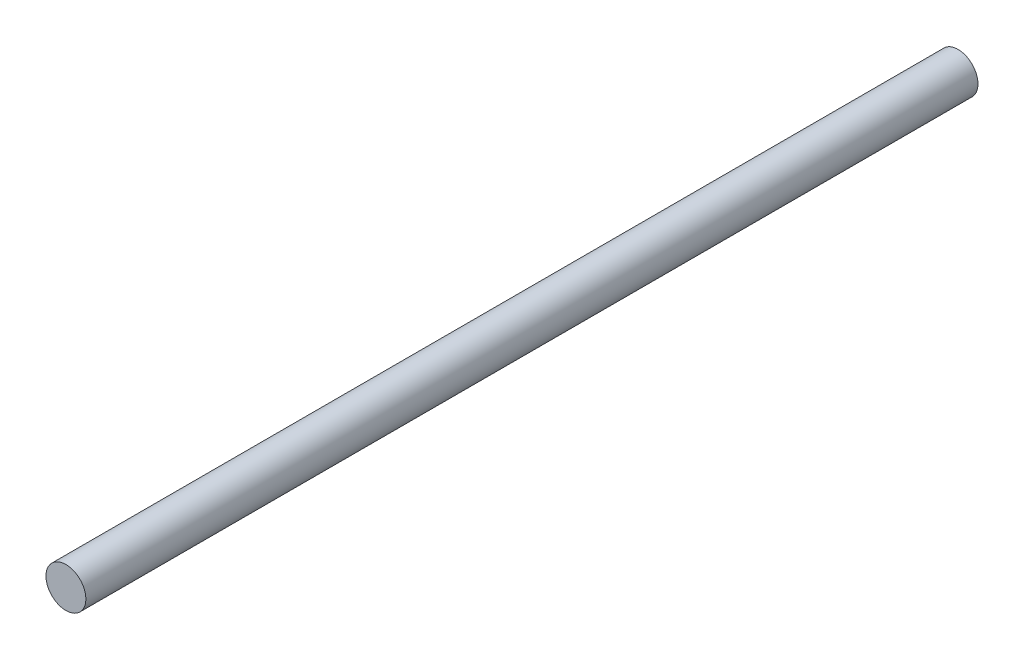
ISO-10303-21;
HEADER;
FILE_DESCRIPTION(('STEP AP214'),'2;1');
FILE_NAME('part.step','',(''),(''),'','','');
FILE_SCHEMA(('AUTOMOTIVE_DESIGN { 1 0 10303 214 1 1 1 1 }'));
ENDSEC;
DATA;
#1=APPLICATION_CONTEXT('core data for automotive mechanical design processes');
#2=APPLICATION_PROTOCOL_DEFINITION('international standard','automotive_design',2000,#1);
#3=PRODUCT_CONTEXT('',#1,'mechanical');
#4=PRODUCT('Part','Part','',(#3));
#5=PRODUCT_RELATED_PRODUCT_CATEGORY('part','',(#4));
#6=PRODUCT_DEFINITION_FORMATION('','',#4);
#7=PRODUCT_DEFINITION_CONTEXT('part definition',#1,'design');
#8=PRODUCT_DEFINITION('design','',#6,#7);
#9=PRODUCT_DEFINITION_SHAPE('','',#8);
#10=(LENGTH_UNIT() NAMED_UNIT(*) SI_UNIT(.MILLI.,.METRE.));
#11=(NAMED_UNIT(*) PLANE_ANGLE_UNIT() SI_UNIT($,.RADIAN.));
#12=(NAMED_UNIT(*) SI_UNIT($,.STERADIAN.) SOLID_ANGLE_UNIT());
#13=UNCERTAINTY_MEASURE_WITH_UNIT(LENGTH_MEASURE(1.E-05),#10,'distance_accuracy_value','');
#14=(GEOMETRIC_REPRESENTATION_CONTEXT(3) GLOBAL_UNCERTAINTY_ASSIGNED_CONTEXT((#13)) GLOBAL_UNIT_ASSIGNED_CONTEXT((#10,
#11,#12)) REPRESENTATION_CONTEXT('',''));
#15=CARTESIAN_POINT('',(0.,0.,0.));
#16=DIRECTION('',(0.,0.,1.));
#17=DIRECTION('',(1.,0.,0.));
#18=AXIS2_PLACEMENT_3D('',#15,#16,#17);
#19=CARTESIAN_POINT('',(0.,0.,-177.8));
#20=DIRECTION('',(0.,0.,1.));
#21=DIRECTION('',(1.,0.,0.));
#22=AXIS2_PLACEMENT_3D('',#19,#20,#21);
#23=CYLINDRICAL_SURFACE('',#22,3.9751);
#24=CARTESIAN_POINT('',(0.,0.,-177.8));
#25=DIRECTION('',(0.,0.,1.));
#26=DIRECTION('',(1.,0.,0.));
#27=AXIS2_PLACEMENT_3D('',#24,#25,#26);
#28=CIRCLE('',#27,3.9751);
#29=CARTESIAN_POINT('',(3.9751,0.,-177.8));
#30=VERTEX_POINT('',#29);
#31=EDGE_CURVE('E10',#30,#30,#28,.T.);
#32=ORIENTED_EDGE('',*,*,#31,.T.);
#33=EDGE_LOOP('',(#32));
#34=FACE_BOUND('',#33,.T.);
#35=CARTESIAN_POINT('',(0.,0.,0.));
#36=DIRECTION('',(0.,0.,1.));
#37=DIRECTION('',(1.,0.,0.));
#38=AXIS2_PLACEMENT_3D('',#35,#36,#37);
#39=CIRCLE('',#38,3.9751);
#40=CARTESIAN_POINT('',(3.9751,0.,0.));
#41=VERTEX_POINT('',#40);
#42=EDGE_CURVE('E34',#41,#41,#39,.T.);
#43=ORIENTED_EDGE('',*,*,#42,.F.);
#44=EDGE_LOOP('',(#43));
#45=FACE_BOUND('',#44,.T.);
#46=ADVANCED_FACE('F31',(#34,#45),#23,.T.);
#47=CARTESIAN_POINT('',(0.,0.,-177.8));
#48=DIRECTION('',(0.,0.,1.));
#49=DIRECTION('',(1.,0.,0.));
#50=AXIS2_PLACEMENT_3D('',#47,#48,#49);
#51=PLANE('',#50);
#52=ORIENTED_EDGE('',*,*,#31,.F.);
#53=EDGE_LOOP('',(#52));
#54=FACE_BOUND('',#53,.T.);
#55=ADVANCED_FACE('F46',(#54),#51,.F.);
#56=CARTESIAN_POINT('',(0.,0.,0.));
#57=DIRECTION('',(0.,0.,1.));
#58=DIRECTION('',(1.,0.,0.));
#59=AXIS2_PLACEMENT_3D('',#56,#57,#58);
#60=PLANE('',#59);
#61=ORIENTED_EDGE('',*,*,#42,.T.);
#62=EDGE_LOOP('',(#61));
#63=FACE_BOUND('',#62,.T.);
#64=ADVANCED_FACE('F43',(#63),#60,.T.);
#65=CLOSED_SHELL('',(#46,#55,#64));
#66=MANIFOLD_SOLID_BREP('B2',#65);
#67=ADVANCED_BREP_SHAPE_REPRESENTATION('',(#18,#66),#14);
#68=SHAPE_DEFINITION_REPRESENTATION(#9,#67);
ENDSEC;
END-ISO-10303-21;
